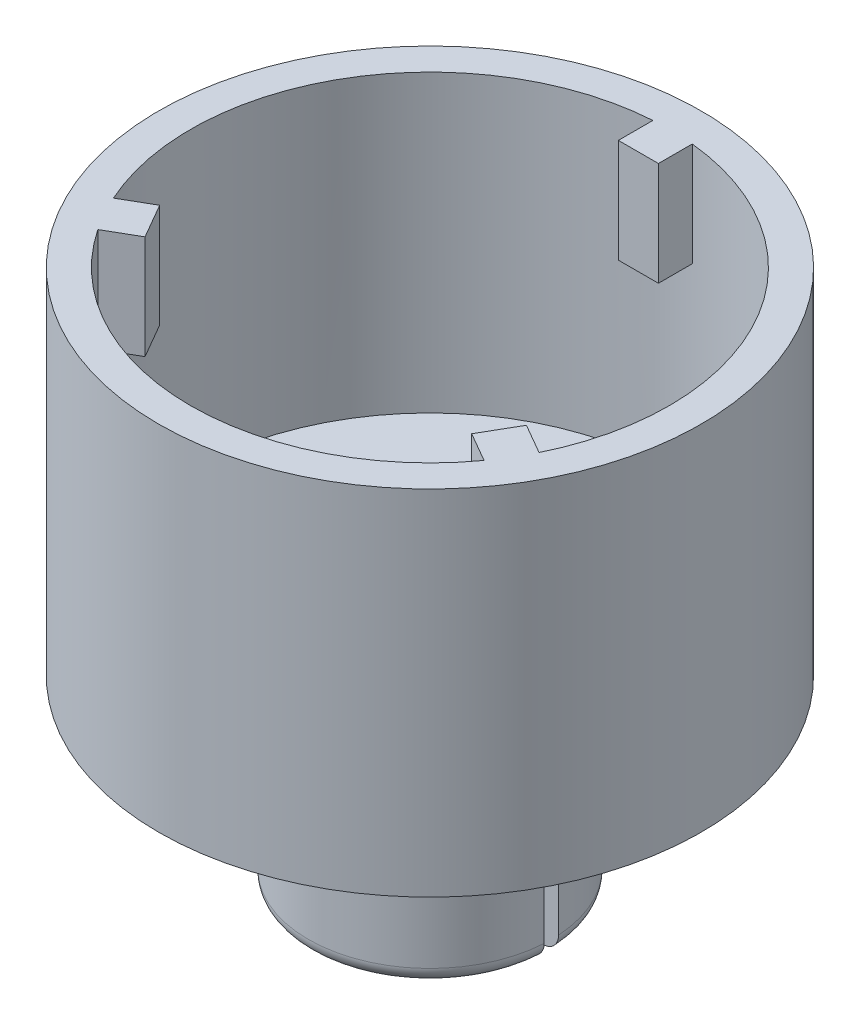
ISO-10303-21;
HEADER;
FILE_DESCRIPTION(('STEP AP214'),'2;1');
FILE_NAME('part.step','',(''),(''),'','','');
FILE_SCHEMA(('AUTOMOTIVE_DESIGN { 1 0 10303 214 1 1 1 1 }'));
ENDSEC;
DATA;
#1=APPLICATION_CONTEXT('core data for automotive mechanical design processes');
#2=APPLICATION_PROTOCOL_DEFINITION('international standard','automotive_design',2000,#1);
#3=PRODUCT_CONTEXT('',#1,'mechanical');
#4=PRODUCT('Part','Part','',(#3));
#5=PRODUCT_RELATED_PRODUCT_CATEGORY('part','',(#4));
#6=PRODUCT_DEFINITION_FORMATION('','',#4);
#7=PRODUCT_DEFINITION_CONTEXT('part definition',#1,'design');
#8=PRODUCT_DEFINITION('design','',#6,#7);
#9=PRODUCT_DEFINITION_SHAPE('','',#8);
#10=(LENGTH_UNIT() NAMED_UNIT(*) SI_UNIT(.MILLI.,.METRE.));
#11=(NAMED_UNIT(*) PLANE_ANGLE_UNIT() SI_UNIT($,.RADIAN.));
#12=(NAMED_UNIT(*) SI_UNIT($,.STERADIAN.) SOLID_ANGLE_UNIT());
#13=UNCERTAINTY_MEASURE_WITH_UNIT(LENGTH_MEASURE(1.E-05),#10,'distance_accuracy_value','');
#14=(GEOMETRIC_REPRESENTATION_CONTEXT(3) GLOBAL_UNCERTAINTY_ASSIGNED_CONTEXT((#13)) GLOBAL_UNIT_ASSIGNED_CONTEXT((#10,
#11,#12)) REPRESENTATION_CONTEXT('',''));
#15=CARTESIAN_POINT('',(0.,0.,0.));
#16=DIRECTION('',(0.,0.,1.));
#17=DIRECTION('',(1.,0.,0.));
#18=AXIS2_PLACEMENT_3D('',#15,#16,#17);
#19=CARTESIAN_POINT('',(0.,-23.,0.));
#20=DIRECTION('',(0.,1.,0.));
#21=DIRECTION('',(0.,0.,1.));
#22=AXIS2_PLACEMENT_3D('',#19,#20,#21);
#23=CYLINDRICAL_SURFACE('',#22,15.25);
#24=DIRECTION('',(0.,1.,0.));
#25=VECTOR('',#24,1.);
#26=CARTESIAN_POINT('',(-15.2232202518428,-23.,0.903363251346434));
#27=LINE('',#26,#25);
#28=CARTESIAN_POINT('',(-15.2232202518428,-7.,0.903363251346434));
#29=VERTEX_POINT('',#28);
#30=CARTESIAN_POINT('',(-15.2232202518428,-21.,0.903363251346434));
#31=VERTEX_POINT('',#30);
#32=EDGE_CURVE('E261',#29,#31,#27,.F.);
#33=ORIENTED_EDGE('',*,*,#32,.T.);
#34=CARTESIAN_POINT('',(0.,-21.,0.));
#35=DIRECTION('',(0.,-1.,0.));
#36=DIRECTION('',(0.,0.,-1.));
#37=AXIS2_PLACEMENT_3D('',#34,#35,#36);
#38=CIRCLE('',#37,15.25);
#39=CARTESIAN_POINT('',(15.2232202518428,-21.,0.903363251346434));
#40=VERTEX_POINT('',#39);
#41=EDGE_CURVE('E253',#31,#40,#38,.F.);
#42=ORIENTED_EDGE('',*,*,#41,.T.);
#43=DIRECTION('',(0.,1.,0.));
#44=VECTOR('',#43,1.);
#45=CARTESIAN_POINT('',(15.2232202518428,-23.,0.903363251346434));
#46=LINE('',#45,#44);
#47=CARTESIAN_POINT('',(15.2232202518428,-7.,0.903363251346434));
#48=VERTEX_POINT('',#47);
#49=EDGE_CURVE('E267',#40,#48,#46,.T.);
#50=ORIENTED_EDGE('',*,*,#49,.T.);
#51=CARTESIAN_POINT('',(0.,-7.,0.));
#52=DIRECTION('',(0.,-1.,0.));
#53=DIRECTION('',(0.,0.,-1.));
#54=AXIS2_PLACEMENT_3D('',#51,#52,#53);
#55=CIRCLE('',#54,15.25);
#56=EDGE_CURVE('E172',#48,#29,#55,.T.);
#57=ORIENTED_EDGE('',*,*,#56,.T.);
#58=EDGE_LOOP('',(#33,#42,#50,#57));
#59=FACE_BOUND('',#58,.T.);
#60=ADVANCED_FACE('F36',(#59),#23,.T.);
#61=CARTESIAN_POINT('',(0.,-23.,0.));
#62=DIRECTION('',(0.,-1.,0.));
#63=DIRECTION('',(0.,0.,-1.));
#64=AXIS2_PLACEMENT_3D('',#61,#62,#63);
#65=PLANE('',#64);
#66=DIRECTION('',(-1.,0.,0.));
#67=VECTOR('',#66,1.);
#68=CARTESIAN_POINT('',(0.,-23.,0.903363251346434));
#69=LINE('',#68,#67);
#70=CARTESIAN_POINT('',(13.2191692188321,-23.,0.903363251346434));
#71=VERTEX_POINT('',#70);
#72=CARTESIAN_POINT('',(-13.2191692188321,-23.,0.903363251346434));
#73=VERTEX_POINT('',#72);
#74=EDGE_CURVE('E204',#71,#73,#69,.T.);
#75=ORIENTED_EDGE('',*,*,#74,.F.);
#76=CARTESIAN_POINT('',(0.,-23.,0.));
#77=DIRECTION('',(0.,-1.,0.));
#78=DIRECTION('',(0.,0.,-1.));
#79=AXIS2_PLACEMENT_3D('',#76,#77,#78);
#80=CIRCLE('',#79,13.25);
#81=EDGE_CURVE('E207',#71,#73,#80,.T.);
#82=ORIENTED_EDGE('',*,*,#81,.T.);
#83=EDGE_LOOP('',(#75,#82));
#84=FACE_BOUND('',#83,.T.);
#85=ADVANCED_FACE('F271',(#84),#65,.T.);
#86=CARTESIAN_POINT('',(0.,44.3,0.));
#87=DIRECTION('',(0.,-1.,0.));
#88=DIRECTION('',(0.,0.,-1.));
#89=AXIS2_PLACEMENT_3D('',#86,#87,#88);
#90=CYLINDRICAL_SURFACE('',#89,34.);
#91=CARTESIAN_POINT('',(0.,44.3,0.));
#92=DIRECTION('',(0.,1.,0.));
#93=DIRECTION('',(0.,0.,1.));
#94=AXIS2_PLACEMENT_3D('',#91,#92,#93);
#95=CIRCLE('',#94,34.);
#96=CARTESIAN_POINT('',(0.,44.3,34.));
#97=VERTEX_POINT('',#96);
#98=EDGE_CURVE('E173',#97,#97,#95,.T.);
#99=ORIENTED_EDGE('',*,*,#98,.F.);
#100=EDGE_LOOP('',(#99));
#101=FACE_BOUND('',#100,.T.);
#102=CARTESIAN_POINT('',(0.,0.,0.));
#103=DIRECTION('',(0.,1.,0.));
#104=DIRECTION('',(0.,0.,1.));
#105=AXIS2_PLACEMENT_3D('',#102,#103,#104);
#106=CIRCLE('',#105,34.);
#107=CARTESIAN_POINT('',(0.,0.,34.));
#108=VERTEX_POINT('',#107);
#109=EDGE_CURVE('E178',#108,#108,#106,.T.);
#110=ORIENTED_EDGE('',*,*,#109,.T.);
#111=EDGE_LOOP('',(#110));
#112=FACE_BOUND('',#111,.T.);
#113=ADVANCED_FACE('F273',(#101,#112),#90,.T.);
#114=CARTESIAN_POINT('',(0.,44.3,0.));
#115=DIRECTION('',(0.,1.,0.));
#116=DIRECTION('',(0.,0.,1.));
#117=AXIS2_PLACEMENT_3D('',#114,#115,#116);
#118=PLANE('',#117);
#119=CARTESIAN_POINT('',(0.,44.3,0.));
#120=DIRECTION('',(0.,1.,0.));
#121=DIRECTION('',(0.,0.,1.));
#122=AXIS2_PLACEMENT_3D('',#119,#120,#121);
#123=CIRCLE('',#122,30.);
#124=CARTESIAN_POINT('',(-1.99053412286535,44.3,-29.933890056351));
#125=VERTEX_POINT('',#124);
#126=CARTESIAN_POINT('',(-27.3630036166739,44.3,12.2990256961229));
#127=VERTEX_POINT('',#126);
#128=EDGE_CURVE('E192',#125,#127,#123,.T.);
#129=ORIENTED_EDGE('',*,*,#128,.F.);
#130=DIRECTION('',(0.,0.,1.));
#131=VECTOR('',#130,1.);
#132=CARTESIAN_POINT('',(-1.99053412286535,44.3,-29.933890056351));
#133=LINE('',#132,#131);
#134=CARTESIAN_POINT('',(-1.99053412286506,44.3,-25.6053170757624));
#135=VERTEX_POINT('',#134);
#136=EDGE_CURVE('E589',#125,#135,#133,.T.);
#137=ORIENTED_EDGE('',*,*,#136,.T.);
#138=DIRECTION('',(1.,0.,0.));
#139=VECTOR('',#138,1.);
#140=CARTESIAN_POINT('',(-1.99053412286506,44.3,-25.6053170757624));
#141=LINE('',#140,#139);
#142=CARTESIAN_POINT('',(3.03023311369694,44.3,-25.6053170757624));
#143=VERTEX_POINT('',#142);
#144=EDGE_CURVE('E610',#135,#143,#141,.T.);
#145=ORIENTED_EDGE('',*,*,#144,.T.);
#146=DIRECTION('',(0.,0.,-1.));
#147=VECTOR('',#146,1.);
#148=CARTESIAN_POINT('',(3.03023311369694,44.3,-25.6053170757624));
#149=LINE('',#148,#147);
#150=CARTESIAN_POINT('',(3.03023311369666,44.3,-29.8465691039465));
#151=VERTEX_POINT('',#150);
#152=EDGE_CURVE('E599',#143,#151,#149,.T.);
#153=ORIENTED_EDGE('',*,*,#152,.T.);
#154=CARTESIAN_POINT('',(26.918776284323,44.3,13.2430919106745));
#155=VERTEX_POINT('',#154);
#156=EDGE_CURVE('E187',#155,#151,#123,.T.);
#157=ORIENTED_EDGE('',*,*,#156,.F.);
#158=DIRECTION('',(-0.866025403784455,0.,-0.499999999999972));
#159=VECTOR('',#158,1.);
#160=CARTESIAN_POINT('',(26.918776284323,44.3,13.2430919106745));
#161=LINE('',#160,#159);
#162=CARTESIAN_POINT('',(23.1701221209983,44.3,11.0788054203803));
#163=VERTEX_POINT('',#162);
#164=EDGE_CURVE('E559',#155,#163,#161,.T.);
#165=ORIENTED_EDGE('',*,*,#164,.T.);
#166=DIRECTION('',(-0.500000000000001,0.,0.866025403784438));
#167=VECTOR('',#166,1.);
#168=CARTESIAN_POINT('',(23.1701221209983,44.3,11.0788054203803));
#169=LINE('',#168,#167);
#170=CARTESIAN_POINT('',(20.6597385027173,44.3,15.4269173937316));
#171=VERTEX_POINT('',#170);
#172=EDGE_CURVE('E581',#163,#171,#169,.T.);
#173=ORIENTED_EDGE('',*,*,#172,.T.);
#174=DIRECTION('',(0.866025403784455,0.,0.499999999999971));
#175=VECTOR('',#174,1.);
#176=CARTESIAN_POINT('',(20.6597385027173,44.3,15.4269173937316));
#177=LINE('',#176,#175);
#178=CARTESIAN_POINT('',(24.332770502977,44.3,17.5475434078235));
#179=VERTEX_POINT('',#178);
#180=EDGE_CURVE('E569',#171,#179,#177,.T.);
#181=ORIENTED_EDGE('',*,*,#180,.T.);
#182=CARTESIAN_POINT('',(-24.9282421614578,44.3,16.6907981456764));
#183=VERTEX_POINT('',#182);
#184=EDGE_CURVE('E193',#183,#179,#123,.T.);
#185=ORIENTED_EDGE('',*,*,#184,.F.);
#186=DIRECTION('',(0.866025403784443,0.,-0.499999999999992));
#187=VECTOR('',#186,1.);
#188=CARTESIAN_POINT('',(-24.9282421614578,44.3,16.6907981456764));
#189=LINE('',#188,#187);
#190=CARTESIAN_POINT('',(-21.1795879981326,44.3,14.5265116553818));
#191=VERTEX_POINT('',#190);
#192=EDGE_CURVE('E535',#183,#191,#189,.T.);
#193=ORIENTED_EDGE('',*,*,#192,.T.);
#194=DIRECTION('',(-0.500000000000112,0.,-0.866025403784374));
#195=VECTOR('',#194,1.);
#196=CARTESIAN_POINT('',(-21.1795879981326,44.3,14.5265116553818));
#197=LINE('',#196,#195);
#198=CARTESIAN_POINT('',(-23.6899716164142,44.3,10.1783996820308));
#199=VERTEX_POINT('',#198);
#200=EDGE_CURVE('E551',#191,#199,#197,.T.);
#201=ORIENTED_EDGE('',*,*,#200,.T.);
#202=DIRECTION('',(-0.866025403784438,0.,0.5));
#203=VECTOR('',#202,1.);
#204=CARTESIAN_POINT('',(-23.6899716164142,44.3,10.1783996820308));
#205=LINE('',#204,#203);
#206=EDGE_CURVE('E539',#199,#127,#205,.T.);
#207=ORIENTED_EDGE('',*,*,#206,.T.);
#208=EDGE_LOOP('',(#129,#137,#145,#153,#157,#165,#173,#181,#185,#193,#201,#207));
#209=FACE_BOUND('',#208,.T.);
#210=ORIENTED_EDGE('',*,*,#98,.T.);
#211=EDGE_LOOP('',(#210));
#212=FACE_BOUND('',#211,.T.);
#213=ADVANCED_FACE('F280',(#209,#212),#118,.T.);
#214=CARTESIAN_POINT('',(0.,0.,0.));
#215=DIRECTION('',(0.,1.,0.));
#216=DIRECTION('',(0.,0.,1.));
#217=AXIS2_PLACEMENT_3D('',#214,#215,#216);
#218=PLANE('',#217);
#219=CARTESIAN_POINT('',(0.,0.,0.));
#220=DIRECTION('',(0.,1.,0.));
#221=DIRECTION('',(0.,0.,1.));
#222=AXIS2_PLACEMENT_3D('',#219,#220,#221);
#223=CIRCLE('',#222,24.5);
#224=CARTESIAN_POINT('',(0.,0.,24.5));
#225=VERTEX_POINT('',#224);
#226=EDGE_CURVE('E199',#225,#225,#223,.T.);
#227=ORIENTED_EDGE('',*,*,#226,.T.);
#228=EDGE_LOOP('',(#227));
#229=FACE_BOUND('',#228,.T.);
#230=ORIENTED_EDGE('',*,*,#109,.F.);
#231=EDGE_LOOP('',(#230));
#232=FACE_BOUND('',#231,.T.);
#233=ADVANCED_FACE('F413',(#229,#232),#218,.F.);
#234=CARTESIAN_POINT('',(0.,7.3,0.));
#235=DIRECTION('',(0.,1.,0.));
#236=DIRECTION('',(0.,0.,1.));
#237=AXIS2_PLACEMENT_3D('',#234,#235,#236);
#238=CYLINDRICAL_SURFACE('',#237,30.);
#239=ORIENTED_EDGE('',*,*,#128,.T.);
#240=DIRECTION('',(0.,1.,0.));
#241=VECTOR('',#240,1.);
#242=CARTESIAN_POINT('',(-27.3630036166739,31.3,12.2990256961229));
#243=LINE('',#242,#241);
#244=CARTESIAN_POINT('',(-27.3630036166739,31.3,12.2990256961229));
#245=VERTEX_POINT('',#244);
#246=EDGE_CURVE('E556',#245,#127,#243,.T.);
#247=ORIENTED_EDGE('',*,*,#246,.F.);
#248=CARTESIAN_POINT('',(0.,31.3,0.));
#249=DIRECTION('',(0.,1.,0.));
#250=DIRECTION('',(0.,0.,1.));
#251=AXIS2_PLACEMENT_3D('',#248,#249,#250);
#252=CIRCLE('',#251,30.);
#253=CARTESIAN_POINT('',(-24.9282421614578,31.3,16.6907981456764));
#254=VERTEX_POINT('',#253);
#255=EDGE_CURVE('E536',#245,#254,#252,.T.);
#256=ORIENTED_EDGE('',*,*,#255,.T.);
#257=DIRECTION('',(0.,1.,0.));
#258=VECTOR('',#257,1.);
#259=CARTESIAN_POINT('',(-24.9282421614578,31.3,16.6907981456764));
#260=LINE('',#259,#258);
#261=EDGE_CURVE('E548',#254,#183,#260,.T.);
#262=ORIENTED_EDGE('',*,*,#261,.T.);
#263=ORIENTED_EDGE('',*,*,#184,.T.);
#264=DIRECTION('',(0.,1.,0.));
#265=VECTOR('',#264,1.);
#266=CARTESIAN_POINT('',(24.332770502977,31.3,17.5475434078235));
#267=LINE('',#266,#265);
#268=CARTESIAN_POINT('',(24.332770502977,31.3,17.5475434078235));
#269=VERTEX_POINT('',#268);
#270=EDGE_CURVE('E586',#269,#179,#267,.T.);
#271=ORIENTED_EDGE('',*,*,#270,.F.);
#272=CARTESIAN_POINT('',(0.,31.3,0.));
#273=DIRECTION('',(0.,1.,0.));
#274=DIRECTION('',(0.,0.,1.));
#275=AXIS2_PLACEMENT_3D('',#272,#273,#274);
#276=CIRCLE('',#275,30.);
#277=CARTESIAN_POINT('',(26.918776284323,31.3,13.2430919106745));
#278=VERTEX_POINT('',#277);
#279=EDGE_CURVE('E566',#269,#278,#276,.T.);
#280=ORIENTED_EDGE('',*,*,#279,.T.);
#281=DIRECTION('',(0.,1.,0.));
#282=VECTOR('',#281,1.);
#283=CARTESIAN_POINT('',(26.918776284323,31.3,13.2430919106745));
#284=LINE('',#283,#282);
#285=EDGE_CURVE('E578',#278,#155,#284,.T.);
#286=ORIENTED_EDGE('',*,*,#285,.T.);
#287=ORIENTED_EDGE('',*,*,#156,.T.);
#288=DIRECTION('',(0.,1.,0.));
#289=VECTOR('',#288,1.);
#290=CARTESIAN_POINT('',(3.03023311369666,31.3,-29.8465691039465));
#291=LINE('',#290,#289);
#292=CARTESIAN_POINT('',(3.03023311369666,31.3,-29.8465691039465));
#293=VERTEX_POINT('',#292);
#294=EDGE_CURVE('E188',#293,#151,#291,.T.);
#295=ORIENTED_EDGE('',*,*,#294,.F.);
#296=CARTESIAN_POINT('',(0.,31.3,0.));
#297=DIRECTION('',(0.,1.,0.));
#298=DIRECTION('',(0.,0.,1.));
#299=AXIS2_PLACEMENT_3D('',#296,#297,#298);
#300=CIRCLE('',#299,30.);
#301=CARTESIAN_POINT('',(-1.99053412286535,31.3,-29.933890056351));
#302=VERTEX_POINT('',#301);
#303=EDGE_CURVE('E596',#293,#302,#300,.T.);
#304=ORIENTED_EDGE('',*,*,#303,.T.);
#305=DIRECTION('',(0.,1.,0.));
#306=VECTOR('',#305,1.);
#307=CARTESIAN_POINT('',(-1.99053412286535,31.3,-29.933890056351));
#308=LINE('',#307,#306);
#309=EDGE_CURVE('E182',#302,#125,#308,.T.);
#310=ORIENTED_EDGE('',*,*,#309,.T.);
#311=EDGE_LOOP('',(#239,#247,#256,#262,#263,#271,#280,#286,#287,#295,#304,#310));
#312=FACE_BOUND('',#311,.T.);
#313=CARTESIAN_POINT('',(0.,7.3,0.));
#314=DIRECTION('',(0.,1.,0.));
#315=DIRECTION('',(0.,0.,1.));
#316=AXIS2_PLACEMENT_3D('',#313,#314,#315);
#317=CIRCLE('',#316,30.);
#318=CARTESIAN_POINT('',(0.,7.3,30.));
#319=VERTEX_POINT('',#318);
#320=EDGE_CURVE('E189',#319,#319,#317,.T.);
#321=ORIENTED_EDGE('',*,*,#320,.F.);
#322=EDGE_LOOP('',(#321));
#323=FACE_BOUND('',#322,.T.);
#324=ADVANCED_FACE('F427',(#312,#323),#238,.F.);
#325=CARTESIAN_POINT('',(0.,7.3,0.));
#326=DIRECTION('',(0.,1.,0.));
#327=DIRECTION('',(0.,0.,1.));
#328=AXIS2_PLACEMENT_3D('',#325,#326,#327);
#329=PLANE('',#328);
#330=ORIENTED_EDGE('',*,*,#320,.T.);
#331=EDGE_LOOP('',(#330));
#332=FACE_BOUND('',#331,.T.);
#333=ADVANCED_FACE('F431',(#332),#329,.T.);
#334=CARTESIAN_POINT('',(0.,-7.,0.));
#335=DIRECTION('',(0.,1.,0.));
#336=DIRECTION('',(0.,0.,1.));
#337=AXIS2_PLACEMENT_3D('',#334,#335,#336);
#338=CYLINDRICAL_SURFACE('',#337,19.5);
#339=CARTESIAN_POINT('',(0.,-5.,0.));
#340=DIRECTION('',(0.,1.,0.));
#341=DIRECTION('',(0.,0.,1.));
#342=AXIS2_PLACEMENT_3D('',#339,#340,#341);
#343=CIRCLE('',#342,19.5);
#344=CARTESIAN_POINT('',(0.,-5.,19.5));
#345=VERTEX_POINT('',#344);
#346=EDGE_CURVE('E176',#345,#345,#343,.F.);
#347=ORIENTED_EDGE('',*,*,#346,.T.);
#348=EDGE_LOOP('',(#347));
#349=FACE_BOUND('',#348,.T.);
#350=CARTESIAN_POINT('',(0.,-7.,0.));
#351=DIRECTION('',(0.,-1.,0.));
#352=DIRECTION('',(0.,0.,-1.));
#353=AXIS2_PLACEMENT_3D('',#350,#351,#352);
#354=CIRCLE('',#353,19.5);
#355=CARTESIAN_POINT('',(0.,-7.,-19.5));
#356=VERTEX_POINT('',#355);
#357=EDGE_CURVE('E184',#356,#356,#354,.T.);
#358=ORIENTED_EDGE('',*,*,#357,.F.);
#359=EDGE_LOOP('',(#358));
#360=FACE_BOUND('',#359,.T.);
#361=ADVANCED_FACE('F442',(#349,#360),#338,.T.);
#362=CARTESIAN_POINT('',(0.,-7.,0.));
#363=DIRECTION('',(0.,-1.,0.));
#364=DIRECTION('',(0.,0.,-1.));
#365=AXIS2_PLACEMENT_3D('',#362,#363,#364);
#366=PLANE('',#365);
#367=ORIENTED_EDGE('',*,*,#56,.F.);
#368=DIRECTION('',(1.,0.,0.));
#369=VECTOR('',#368,1.);
#370=CARTESIAN_POINT('',(33.0968426441505,-7.,0.903363251346434));
#371=LINE('',#370,#369);
#372=EDGE_CURVE('E169',#29,#48,#371,.T.);
#373=ORIENTED_EDGE('',*,*,#372,.F.);
#374=EDGE_LOOP('',(#367,#373));
#375=FACE_BOUND('',#374,.T.);
#376=CARTESIAN_POINT('',(-15.2232202518428,-7.,-0.903363251346434));
#377=VERTEX_POINT('',#376);
#378=CARTESIAN_POINT('',(15.2232202518428,-7.,-0.903363251346434));
#379=VERTEX_POINT('',#378);
#380=EDGE_CURVE('E168',#377,#379,#55,.T.);
#381=ORIENTED_EDGE('',*,*,#380,.F.);
#382=DIRECTION('',(-1.,0.,0.));
#383=VECTOR('',#382,1.);
#384=CARTESIAN_POINT('',(33.0968426441505,-7.,-0.903363251346434));
#385=LINE('',#384,#383);
#386=EDGE_CURVE('E160',#379,#377,#385,.T.);
#387=ORIENTED_EDGE('',*,*,#386,.F.);
#388=EDGE_LOOP('',(#381,#387));
#389=FACE_BOUND('',#388,.T.);
#390=ORIENTED_EDGE('',*,*,#357,.T.);
#391=EDGE_LOOP('',(#390));
#392=FACE_BOUND('',#391,.T.);
#393=ADVANCED_FACE('F166',(#375,#389,#392),#366,.T.);
#394=DIRECTION('',(0.,1.,0.));
#395=VECTOR('',#394,1.);
#396=CARTESIAN_POINT('',(15.2232202518428,-23.,-0.903363251346434));
#397=LINE('',#396,#395);
#398=CARTESIAN_POINT('',(15.2232202518428,-21.,-0.903363251346434));
#399=VERTEX_POINT('',#398);
#400=EDGE_CURVE('E157',#379,#399,#397,.F.);
#401=ORIENTED_EDGE('',*,*,#400,.T.);
#402=CARTESIAN_POINT('',(0.,-21.,0.));
#403=DIRECTION('',(0.,-1.,0.));
#404=DIRECTION('',(0.,0.,-1.));
#405=AXIS2_PLACEMENT_3D('',#402,#403,#404);
#406=CIRCLE('',#405,15.25);
#407=CARTESIAN_POINT('',(-15.2232202518428,-21.,-0.903363251346434));
#408=VERTEX_POINT('',#407);
#409=EDGE_CURVE('E11',#399,#408,#406,.F.);
#410=ORIENTED_EDGE('',*,*,#409,.T.);
#411=DIRECTION('',(0.,1.,0.));
#412=VECTOR('',#411,1.);
#413=CARTESIAN_POINT('',(-15.2232202518428,-23.,-0.903363251346434));
#414=LINE('',#413,#412);
#415=EDGE_CURVE('E163',#408,#377,#414,.T.);
#416=ORIENTED_EDGE('',*,*,#415,.T.);
#417=ORIENTED_EDGE('',*,*,#380,.T.);
#418=EDGE_LOOP('',(#401,#410,#416,#417));
#419=FACE_BOUND('',#418,.T.);
#420=ADVANCED_FACE('F171',(#419),#23,.T.);
#421=DIRECTION('',(1.,0.,0.));
#422=VECTOR('',#421,1.);
#423=CARTESIAN_POINT('',(0.,-23.,-0.903363251346434));
#424=LINE('',#423,#422);
#425=CARTESIAN_POINT('',(-13.2191692188321,-23.,-0.903363251346434));
#426=VERTEX_POINT('',#425);
#427=CARTESIAN_POINT('',(13.2191692188321,-23.,-0.903363251346434));
#428=VERTEX_POINT('',#427);
#429=EDGE_CURVE('E202',#426,#428,#424,.T.);
#430=ORIENTED_EDGE('',*,*,#429,.F.);
#431=CARTESIAN_POINT('',(0.,-23.,0.));
#432=DIRECTION('',(0.,-1.,0.));
#433=DIRECTION('',(0.,0.,-1.));
#434=AXIS2_PLACEMENT_3D('',#431,#432,#433);
#435=CIRCLE('',#434,13.25);
#436=EDGE_CURVE('E249',#426,#428,#435,.T.);
#437=ORIENTED_EDGE('',*,*,#436,.T.);
#438=EDGE_LOOP('',(#430,#437));
#439=FACE_BOUND('',#438,.T.);
#440=ADVANCED_FACE('F275',(#439),#65,.T.);
#441=CARTESIAN_POINT('',(0.,-5.,0.));
#442=DIRECTION('',(0.,1.,0.));
#443=DIRECTION('',(0.,0.,1.));
#444=AXIS2_PLACEMENT_3D('',#441,#442,#443);
#445=TOROIDAL_SURFACE('',#444,24.5,5.);
#446=ORIENTED_EDGE('',*,*,#226,.F.);
#447=EDGE_LOOP('',(#446));
#448=FACE_BOUND('',#447,.T.);
#449=ORIENTED_EDGE('',*,*,#346,.F.);
#450=EDGE_LOOP('',(#449));
#451=FACE_BOUND('',#450,.T.);
#452=ADVANCED_FACE('F286',(#448,#451),#445,.F.);
#453=CARTESIAN_POINT('',(3.03023311369694,31.3,-25.6053170757624));
#454=DIRECTION('',(1.,0.,0.));
#455=DIRECTION('',(0.,0.,-1.));
#456=AXIS2_PLACEMENT_3D('',#453,#454,#455);
#457=PLANE('',#456);
#458=ORIENTED_EDGE('',*,*,#152,.F.);
#459=DIRECTION('',(0.,1.,0.));
#460=VECTOR('',#459,1.);
#461=CARTESIAN_POINT('',(3.03023311369694,31.3,-25.6053170757624));
#462=LINE('',#461,#460);
#463=CARTESIAN_POINT('',(3.03023311369694,31.3,-25.6053170757624));
#464=VERTEX_POINT('',#463);
#465=EDGE_CURVE('E617',#464,#143,#462,.T.);
#466=ORIENTED_EDGE('',*,*,#465,.F.);
#467=DIRECTION('',(0.,0.,-1.));
#468=VECTOR('',#467,1.);
#469=CARTESIAN_POINT('',(3.03023311369694,31.3,-25.6053170757624));
#470=LINE('',#469,#468);
#471=EDGE_CURVE('E605',#464,#293,#470,.T.);
#472=ORIENTED_EDGE('',*,*,#471,.T.);
#473=ORIENTED_EDGE('',*,*,#294,.T.);
#474=EDGE_LOOP('',(#458,#466,#472,#473));
#475=FACE_BOUND('',#474,.T.);
#476=ADVANCED_FACE('F291',(#475),#457,.T.);
#477=CARTESIAN_POINT('',(-1.99053412286506,31.3,-25.6053170757624));
#478=DIRECTION('',(0.,0.,1.));
#479=DIRECTION('',(1.,0.,0.));
#480=AXIS2_PLACEMENT_3D('',#477,#478,#479);
#481=PLANE('',#480);
#482=ORIENTED_EDGE('',*,*,#144,.F.);
#483=DIRECTION('',(0.,1.,0.));
#484=VECTOR('',#483,1.);
#485=CARTESIAN_POINT('',(-1.99053412286506,31.3,-25.6053170757624));
#486=LINE('',#485,#484);
#487=CARTESIAN_POINT('',(-1.99053412286506,31.3,-25.6053170757624));
#488=VERTEX_POINT('',#487);
#489=EDGE_CURVE('E618',#488,#135,#486,.T.);
#490=ORIENTED_EDGE('',*,*,#489,.F.);
#491=DIRECTION('',(1.,0.,0.));
#492=VECTOR('',#491,1.);
#493=CARTESIAN_POINT('',(-1.99053412286506,31.3,-25.6053170757624));
#494=LINE('',#493,#492);
#495=EDGE_CURVE('E602',#488,#464,#494,.T.);
#496=ORIENTED_EDGE('',*,*,#495,.T.);
#497=ORIENTED_EDGE('',*,*,#465,.T.);
#498=EDGE_LOOP('',(#482,#490,#496,#497));
#499=FACE_BOUND('',#498,.T.);
#500=ADVANCED_FACE('F385',(#499),#481,.T.);
#501=CARTESIAN_POINT('',(-1.99053412286535,31.3,-29.933890056351));
#502=DIRECTION('',(-1.,0.,0.));
#503=DIRECTION('',(0.,0.,1.));
#504=AXIS2_PLACEMENT_3D('',#501,#502,#503);
#505=PLANE('',#504);
#506=ORIENTED_EDGE('',*,*,#136,.F.);
#507=ORIENTED_EDGE('',*,*,#309,.F.);
#508=DIRECTION('',(0.,0.,1.));
#509=VECTOR('',#508,1.);
#510=CARTESIAN_POINT('',(-1.99053412286535,31.3,-29.933890056351));
#511=LINE('',#510,#509);
#512=EDGE_CURVE('E598',#302,#488,#511,.T.);
#513=ORIENTED_EDGE('',*,*,#512,.T.);
#514=ORIENTED_EDGE('',*,*,#489,.T.);
#515=EDGE_LOOP('',(#506,#507,#513,#514));
#516=FACE_BOUND('',#515,.T.);
#517=ADVANCED_FACE('F377',(#516),#505,.T.);
#518=CARTESIAN_POINT('',(0.,31.3,0.));
#519=DIRECTION('',(0.,1.,0.));
#520=DIRECTION('',(0.,0.,1.));
#521=AXIS2_PLACEMENT_3D('',#518,#519,#520);
#522=PLANE('',#521);
#523=ORIENTED_EDGE('',*,*,#303,.F.);
#524=ORIENTED_EDGE('',*,*,#471,.F.);
#525=ORIENTED_EDGE('',*,*,#495,.F.);
#526=ORIENTED_EDGE('',*,*,#512,.F.);
#527=EDGE_LOOP('',(#523,#524,#525,#526));
#528=FACE_BOUND('',#527,.T.);
#529=ADVANCED_FACE('F369',(#528),#522,.F.);
#530=CARTESIAN_POINT('',(20.6597385027173,31.3,15.4269173937316));
#531=DIRECTION('',(-0.499999999999971,0.,0.866025403784455));
#532=DIRECTION('',(0.866025403784455,0.,0.499999999999971));
#533=AXIS2_PLACEMENT_3D('',#530,#531,#532);
#534=PLANE('',#533);
#535=ORIENTED_EDGE('',*,*,#180,.F.);
#536=DIRECTION('',(0.,1.,0.));
#537=VECTOR('',#536,1.);
#538=CARTESIAN_POINT('',(20.6597385027173,31.3,15.4269173937316));
#539=LINE('',#538,#537);
#540=CARTESIAN_POINT('',(20.6597385027173,31.3,15.4269173937316));
#541=VERTEX_POINT('',#540);
#542=EDGE_CURVE('E590',#541,#171,#539,.T.);
#543=ORIENTED_EDGE('',*,*,#542,.F.);
#544=DIRECTION('',(0.866025403784455,0.,0.499999999999971));
#545=VECTOR('',#544,1.);
#546=CARTESIAN_POINT('',(20.6597385027173,31.3,15.4269173937316));
#547=LINE('',#546,#545);
#548=EDGE_CURVE('E575',#541,#269,#547,.T.);
#549=ORIENTED_EDGE('',*,*,#548,.T.);
#550=ORIENTED_EDGE('',*,*,#270,.T.);
#551=EDGE_LOOP('',(#535,#543,#549,#550));
#552=FACE_BOUND('',#551,.T.);
#553=ADVANCED_FACE('F361',(#552),#534,.T.);
#554=CARTESIAN_POINT('',(23.1701221209983,31.3,11.0788054203803));
#555=DIRECTION('',(-0.866025403784438,0.,-0.500000000000001));
#556=DIRECTION('',(-0.500000000000001,0.,0.866025403784438));
#557=AXIS2_PLACEMENT_3D('',#554,#555,#556);
#558=PLANE('',#557);
#559=ORIENTED_EDGE('',*,*,#172,.F.);
#560=DIRECTION('',(0.,1.,0.));
#561=VECTOR('',#560,1.);
#562=CARTESIAN_POINT('',(23.1701221209983,31.3,11.0788054203803));
#563=LINE('',#562,#561);
#564=CARTESIAN_POINT('',(23.1701221209983,31.3,11.0788054203803));
#565=VERTEX_POINT('',#564);
#566=EDGE_CURVE('E592',#565,#163,#563,.T.);
#567=ORIENTED_EDGE('',*,*,#566,.F.);
#568=DIRECTION('',(-0.500000000000001,0.,0.866025403784438));
#569=VECTOR('',#568,1.);
#570=CARTESIAN_POINT('',(23.1701221209983,31.3,11.0788054203803));
#571=LINE('',#570,#569);
#572=EDGE_CURVE('E572',#565,#541,#571,.T.);
#573=ORIENTED_EDGE('',*,*,#572,.T.);
#574=ORIENTED_EDGE('',*,*,#542,.T.);
#575=EDGE_LOOP('',(#559,#567,#573,#574));
#576=FACE_BOUND('',#575,.T.);
#577=ADVANCED_FACE('F353',(#576),#558,.T.);
#578=CARTESIAN_POINT('',(26.918776284323,31.3,13.2430919106745));
#579=DIRECTION('',(0.499999999999972,0.,-0.866025403784455));
#580=DIRECTION('',(-0.866025403784455,0.,-0.499999999999972));
#581=AXIS2_PLACEMENT_3D('',#578,#579,#580);
#582=PLANE('',#581);
#583=ORIENTED_EDGE('',*,*,#164,.F.);
#584=ORIENTED_EDGE('',*,*,#285,.F.);
#585=DIRECTION('',(-0.866025403784455,0.,-0.499999999999972));
#586=VECTOR('',#585,1.);
#587=CARTESIAN_POINT('',(26.918776284323,31.3,13.2430919106745));
#588=LINE('',#587,#586);
#589=EDGE_CURVE('E568',#278,#565,#588,.T.);
#590=ORIENTED_EDGE('',*,*,#589,.T.);
#591=ORIENTED_EDGE('',*,*,#566,.T.);
#592=EDGE_LOOP('',(#583,#584,#590,#591));
#593=FACE_BOUND('',#592,.T.);
#594=ADVANCED_FACE('F345',(#593),#582,.T.);
#595=CARTESIAN_POINT('',(0.,31.3,0.));
#596=DIRECTION('',(0.,1.,0.));
#597=DIRECTION('',(0.,0.,1.));
#598=AXIS2_PLACEMENT_3D('',#595,#596,#597);
#599=PLANE('',#598);
#600=ORIENTED_EDGE('',*,*,#279,.F.);
#601=ORIENTED_EDGE('',*,*,#548,.F.);
#602=ORIENTED_EDGE('',*,*,#572,.F.);
#603=ORIENTED_EDGE('',*,*,#589,.F.);
#604=EDGE_LOOP('',(#600,#601,#602,#603));
#605=FACE_BOUND('',#604,.T.);
#606=ADVANCED_FACE('F338',(#605),#599,.F.);
#607=CARTESIAN_POINT('',(-23.6899716164142,31.3,10.1783996820308));
#608=DIRECTION('',(-0.5,0.,-0.866025403784439));
#609=DIRECTION('',(-0.866025403784439,0.,0.5));
#610=AXIS2_PLACEMENT_3D('',#607,#608,#609);
#611=PLANE('',#610);
#612=ORIENTED_EDGE('',*,*,#206,.F.);
#613=DIRECTION('',(0.,1.,0.));
#614=VECTOR('',#613,1.);
#615=CARTESIAN_POINT('',(-23.6899716164142,31.3,10.1783996820308));
#616=LINE('',#615,#614);
#617=CARTESIAN_POINT('',(-23.6899716164142,31.3,10.1783996820308));
#618=VERTEX_POINT('',#617);
#619=EDGE_CURVE('E560',#618,#199,#616,.T.);
#620=ORIENTED_EDGE('',*,*,#619,.F.);
#621=DIRECTION('',(-0.866025403784438,0.,0.5));
#622=VECTOR('',#621,1.);
#623=CARTESIAN_POINT('',(-23.6899716164142,31.3,10.1783996820308));
#624=LINE('',#623,#622);
#625=EDGE_CURVE('E545',#618,#245,#624,.T.);
#626=ORIENTED_EDGE('',*,*,#625,.T.);
#627=ORIENTED_EDGE('',*,*,#246,.T.);
#628=EDGE_LOOP('',(#612,#620,#626,#627));
#629=FACE_BOUND('',#628,.T.);
#630=ADVANCED_FACE('F330',(#629),#611,.T.);
#631=CARTESIAN_POINT('',(-21.1795879981326,31.3,14.5265116553818));
#632=DIRECTION('',(0.866025403784374,0.,-0.500000000000112));
#633=DIRECTION('',(-0.500000000000112,0.,-0.866025403784374));
#634=AXIS2_PLACEMENT_3D('',#631,#632,#633);
#635=PLANE('',#634);
#636=ORIENTED_EDGE('',*,*,#200,.F.);
#637=DIRECTION('',(0.,1.,0.));
#638=VECTOR('',#637,1.);
#639=CARTESIAN_POINT('',(-21.1795879981326,31.3,14.5265116553818));
#640=LINE('',#639,#638);
#641=CARTESIAN_POINT('',(-21.1795879981326,31.3,14.5265116553818));
#642=VERTEX_POINT('',#641);
#643=EDGE_CURVE('E562',#642,#191,#640,.T.);
#644=ORIENTED_EDGE('',*,*,#643,.F.);
#645=DIRECTION('',(-0.500000000000112,0.,-0.866025403784374));
#646=VECTOR('',#645,1.);
#647=CARTESIAN_POINT('',(-21.1795879981326,31.3,14.5265116553818));
#648=LINE('',#647,#646);
#649=EDGE_CURVE('E542',#642,#618,#648,.T.);
#650=ORIENTED_EDGE('',*,*,#649,.T.);
#651=ORIENTED_EDGE('',*,*,#619,.T.);
#652=EDGE_LOOP('',(#636,#644,#650,#651));
#653=FACE_BOUND('',#652,.T.);
#654=ADVANCED_FACE('F322',(#653),#635,.T.);
#655=CARTESIAN_POINT('',(-24.9282421614578,31.3,16.6907981456764));
#656=DIRECTION('',(0.499999999999992,0.,0.866025403784443));
#657=DIRECTION('',(0.866025403784443,0.,-0.499999999999992));
#658=AXIS2_PLACEMENT_3D('',#655,#656,#657);
#659=PLANE('',#658);
#660=ORIENTED_EDGE('',*,*,#192,.F.);
#661=ORIENTED_EDGE('',*,*,#261,.F.);
#662=DIRECTION('',(0.866025403784443,0.,-0.499999999999992));
#663=VECTOR('',#662,1.);
#664=CARTESIAN_POINT('',(-24.9282421614578,31.3,16.6907981456764));
#665=LINE('',#664,#663);
#666=EDGE_CURVE('E538',#254,#642,#665,.T.);
#667=ORIENTED_EDGE('',*,*,#666,.T.);
#668=ORIENTED_EDGE('',*,*,#643,.T.);
#669=EDGE_LOOP('',(#660,#661,#667,#668));
#670=FACE_BOUND('',#669,.T.);
#671=ADVANCED_FACE('F314',(#670),#659,.T.);
#672=CARTESIAN_POINT('',(0.,31.3,0.));
#673=DIRECTION('',(0.,1.,0.));
#674=DIRECTION('',(0.,0.,1.));
#675=AXIS2_PLACEMENT_3D('',#672,#673,#674);
#676=PLANE('',#675);
#677=ORIENTED_EDGE('',*,*,#255,.F.);
#678=ORIENTED_EDGE('',*,*,#625,.F.);
#679=ORIENTED_EDGE('',*,*,#649,.F.);
#680=ORIENTED_EDGE('',*,*,#666,.F.);
#681=EDGE_LOOP('',(#677,#678,#679,#680));
#682=FACE_BOUND('',#681,.T.);
#683=ADVANCED_FACE('F230',(#682),#676,.F.);
#684=CARTESIAN_POINT('',(33.0968426441505,59.2183375863677,0.903363251346434));
#685=DIRECTION('',(0.,0.,1.));
#686=DIRECTION('',(1.,0.,0.));
#687=AXIS2_PLACEMENT_3D('',#684,#685,#686);
#688=PLANE('',#687);
#689=ORIENTED_EDGE('',*,*,#74,.T.);
#690=CARTESIAN_POINT('',(-13.2191692188321,-23.,0.903363251346434));
#691=CARTESIAN_POINT('',(-13.2756424415771,-22.9999995609033,0.903363251346434));
#692=CARTESIAN_POINT('',(-13.3320887054836,-22.9976177069956,0.903363251346434));
#693=CARTESIAN_POINT('',(-13.444578403289,-22.9881142320961,0.903363251346434));
#694=CARTESIAN_POINT('',(-13.5006218535148,-22.9809928043156,0.903363251346434));
#695=CARTESIAN_POINT('',(-13.6674559687125,-22.9525833628222,0.903363251346434));
#696=CARTESIAN_POINT('',(-13.777130720685,-22.924250021228,0.903363251346434));
#697=CARTESIAN_POINT('',(-13.990165743797,-22.8495662000696,0.903363251346434));
#698=CARTESIAN_POINT('',(-14.0935227313194,-22.8032064419995,0.903363251346434));
#699=CARTESIAN_POINT('',(-14.2909681297702,-22.6937771474923,0.903363251346434));
#700=CARTESIAN_POINT('',(-14.3850583874932,-22.6307109498138,0.903363251346434));
#701=CARTESIAN_POINT('',(-14.5611727518909,-22.4897357020745,0.903363251346434));
#702=CARTESIAN_POINT('',(-14.6432117380692,-22.4118452329068,0.903363251346434));
#703=CARTESIAN_POINT('',(-14.7930355008666,-22.2433537734592,0.903363251346434));
#704=CARTESIAN_POINT('',(-14.8608175189015,-22.1527503289859,0.903363251346434));
#705=CARTESIAN_POINT('',(-14.9800524877207,-21.9616010447955,0.903363251346434));
#706=CARTESIAN_POINT('',(-15.0315336292775,-21.8610727685841,0.903363251346434));
#707=CARTESIAN_POINT('',(-15.1168307364638,-21.6528115741693,0.903363251346434));
#708=CARTESIAN_POINT('',(-15.1506575112983,-21.5450831101023,0.903363251346434));
#709=CARTESIAN_POINT('',(-15.1911452567023,-21.3638957315863,0.903363251346434));
#710=CARTESIAN_POINT('',(-15.203166194833,-21.2915894160377,0.903363251346434));
#711=CARTESIAN_POINT('',(-15.2192024915324,-21.1461989766328,0.903363251346434));
#712=CARTESIAN_POINT('',(-15.2232292335094,-21.073116107964,0.903363251346434));
#713=CARTESIAN_POINT('',(-15.2232202518428,-21.,0.903363251346434));
#714=B_SPLINE_CURVE_WITH_KNOTS('',3,(#690,#691,#692,#693,#694,#695,#696,#697,#698,#699,#700,
#701,#702,#703,#704,#705,#706,#707,#708,#709,#710,#711,#712,#713),.UNSPECIFIED.,.F.,.F.,(4,2,2,
2,2,2,2,2,2,2,2,4),(0.,0.169315847013464,0.33862479220124,0.67670859120119,1.01496663858033,
1.35315713649493,1.69092650183992,2.02876116226415,2.3660083385944,2.70304878629595,
2.92253432632545,3.14170710311557),.UNSPECIFIED.);
#715=EDGE_CURVE('E217',#73,#31,#714,.T.);
#716=ORIENTED_EDGE('',*,*,#715,.T.);
#717=ORIENTED_EDGE('',*,*,#32,.F.);
#718=ORIENTED_EDGE('',*,*,#372,.T.);
#719=ORIENTED_EDGE('',*,*,#49,.F.);
#720=CARTESIAN_POINT('',(15.2232202518428,-21.,0.903363251346434));
#721=CARTESIAN_POINT('',(15.2232199232489,-21.0561948021802,0.903363251346434));
#722=CARTESIAN_POINT('',(15.2208462010748,-21.1123626608613,0.903363251346434));
#723=CARTESIAN_POINT('',(15.211376767415,-21.2242959584954,0.903363251346434));
#724=CARTESIAN_POINT('',(15.2042812970132,-21.2800614178472,0.903363251346434));
#725=CARTESIAN_POINT('',(15.1759810982783,-21.4460523458939,0.903363251346434));
#726=CARTESIAN_POINT('',(15.1477623870815,-21.5551651452531,0.903363251346434));
#727=CARTESIAN_POINT('',(15.0734106566527,-21.7671001409726,0.903363251346434));
#728=CARTESIAN_POINT('',(15.0272693095068,-21.8699193872293,0.903363251346434));
#729=CARTESIAN_POINT('',(14.9183959883233,-22.0663574694,0.903363251346434));
#730=CARTESIAN_POINT('',(14.8556667286063,-22.1599778071192,0.903363251346434));
#731=CARTESIAN_POINT('',(14.7153560416617,-22.3354365581613,0.903363251346434));
#732=CARTESIAN_POINT('',(14.6377642041245,-22.4172666423318,0.903363251346434));
#733=CARTESIAN_POINT('',(14.469946451435,-22.5667823902729,0.903363251346434));
#734=CARTESIAN_POINT('',(14.3797180536156,-22.6344652680558,0.903363251346434));
#735=CARTESIAN_POINT('',(14.1890336936746,-22.7538779272838,0.903363251346434));
#736=CARTESIAN_POINT('',(14.0885588357039,-22.8055774991095,0.903363251346434));
#737=CARTESIAN_POINT('',(13.8803857068313,-22.8913863101094,0.903363251346434));
#738=CARTESIAN_POINT('',(13.7726914572009,-22.925505251361,0.903363251346434));
#739=CARTESIAN_POINT('',(13.5901629405491,-22.9668623444403,0.903363251346434));
#740=CARTESIAN_POINT('',(13.5164605185664,-22.9792819990314,0.903363251346434));
#741=CARTESIAN_POINT('',(13.368238510768,-22.9958498253569,0.903363251346434));
#742=CARTESIAN_POINT('',(13.2937202413688,-23.0000097771421,0.903363251346434));
#743=CARTESIAN_POINT('',(13.2191692188321,-23.,0.903363251346434));
#744=B_SPLINE_CURVE_WITH_KNOTS('',3,(#720,#721,#722,#723,#724,#725,#726,#727,#728,#729,#730,
#731,#732,#733,#734,#735,#736,#737,#738,#739,#740,#741,#742,#743),.UNSPECIFIED.,.F.,.F.,(4,2,2,
2,2,2,2,2,2,2,2,4),(0.,0.168480781633668,0.336952961602159,0.673326346007657,1.00985621666657,
1.34633105416501,1.68304243888204,2.01982006931767,2.35723039660949,2.69445432008634,
2.91824695183647,3.14172017891371),.UNSPECIFIED.);
#745=EDGE_CURVE('E210',#40,#71,#744,.T.);
#746=ORIENTED_EDGE('',*,*,#745,.T.);
#747=EDGE_LOOP('',(#689,#716,#717,#718,#719,#746));
#748=FACE_BOUND('',#747,.T.);
#749=ADVANCED_FACE('F226',(#748),#688,.F.);
#750=CARTESIAN_POINT('',(33.0968426441505,59.2183375863677,-0.903363251346434));
#751=DIRECTION('',(0.,0.,-1.));
#752=DIRECTION('',(-1.,0.,0.));
#753=AXIS2_PLACEMENT_3D('',#750,#751,#752);
#754=PLANE('',#753);
#755=ORIENTED_EDGE('',*,*,#429,.T.);
#756=CARTESIAN_POINT('',(13.2191692188321,-23.,-0.903363251346434));
#757=CARTESIAN_POINT('',(13.2756424415771,-22.9999995609033,-0.903363251346434));
#758=CARTESIAN_POINT('',(13.3320887054836,-22.9976177069956,-0.903363251346434));
#759=CARTESIAN_POINT('',(13.444578403289,-22.9881142320961,-0.903363251346434));
#760=CARTESIAN_POINT('',(13.5006218535148,-22.9809928043156,-0.903363251346434));
#761=CARTESIAN_POINT('',(13.6674559687125,-22.9525833628222,-0.903363251346434));
#762=CARTESIAN_POINT('',(13.777130720685,-22.924250021228,-0.903363251346434));
#763=CARTESIAN_POINT('',(13.990165743797,-22.8495662000696,-0.903363251346434));
#764=CARTESIAN_POINT('',(14.0935227313194,-22.8032064419995,-0.903363251346434));
#765=CARTESIAN_POINT('',(14.2909681297702,-22.6937771474923,-0.903363251346434));
#766=CARTESIAN_POINT('',(14.3850583874932,-22.6307109498138,-0.903363251346434));
#767=CARTESIAN_POINT('',(14.5611727518909,-22.4897357020745,-0.903363251346434));
#768=CARTESIAN_POINT('',(14.6432117380692,-22.4118452329068,-0.903363251346434));
#769=CARTESIAN_POINT('',(14.7930355008666,-22.2433537734592,-0.903363251346434));
#770=CARTESIAN_POINT('',(14.8608175189015,-22.1527503289859,-0.903363251346434));
#771=CARTESIAN_POINT('',(14.9800524877207,-21.9616010447955,-0.903363251346434));
#772=CARTESIAN_POINT('',(15.0315336292775,-21.8610727685841,-0.903363251346434));
#773=CARTESIAN_POINT('',(15.1168307364638,-21.6528115741693,-0.903363251346434));
#774=CARTESIAN_POINT('',(15.1506575112983,-21.5450831101023,-0.903363251346434));
#775=CARTESIAN_POINT('',(15.1911452567023,-21.3638957315863,-0.903363251346434));
#776=CARTESIAN_POINT('',(15.203166194833,-21.2915894160377,-0.903363251346434));
#777=CARTESIAN_POINT('',(15.2192024915324,-21.1461989766328,-0.903363251346434));
#778=CARTESIAN_POINT('',(15.2232292335094,-21.073116107964,-0.903363251346434));
#779=CARTESIAN_POINT('',(15.2232202518428,-21.,-0.903363251346434));
#780=B_SPLINE_CURVE_WITH_KNOTS('',3,(#756,#757,#758,#759,#760,#761,#762,#763,#764,#765,#766,
#767,#768,#769,#770,#771,#772,#773,#774,#775,#776,#777,#778,#779),.UNSPECIFIED.,.F.,.F.,(4,2,2,
2,2,2,2,2,2,2,2,4),(0.,0.169315847013464,0.33862479220124,0.67670859120119,1.01496663858033,
1.35315713649493,1.69092650183992,2.02876116226415,2.3660083385944,2.70304878629595,
2.92253432632545,3.14170710311557),.UNSPECIFIED.);
#781=EDGE_CURVE('E45',#428,#399,#780,.T.);
#782=ORIENTED_EDGE('',*,*,#781,.T.);
#783=ORIENTED_EDGE('',*,*,#400,.F.);
#784=ORIENTED_EDGE('',*,*,#386,.T.);
#785=ORIENTED_EDGE('',*,*,#415,.F.);
#786=CARTESIAN_POINT('',(-15.2232202518428,-21.,-0.903363251346434));
#787=CARTESIAN_POINT('',(-15.2232199232489,-21.0561948021802,-0.903363251346434));
#788=CARTESIAN_POINT('',(-15.2208462010748,-21.1123626608613,-0.903363251346434));
#789=CARTESIAN_POINT('',(-15.211376767415,-21.2242959584954,-0.903363251346434));
#790=CARTESIAN_POINT('',(-15.2042812970132,-21.2800614178472,-0.903363251346434));
#791=CARTESIAN_POINT('',(-15.1759810982783,-21.4460523458939,-0.903363251346434));
#792=CARTESIAN_POINT('',(-15.1477623870815,-21.5551651452531,-0.903363251346434));
#793=CARTESIAN_POINT('',(-15.0734106566527,-21.7671001409726,-0.903363251346434));
#794=CARTESIAN_POINT('',(-15.0272693095068,-21.8699193872293,-0.903363251346434));
#795=CARTESIAN_POINT('',(-14.9183959883233,-22.0663574694,-0.903363251346434));
#796=CARTESIAN_POINT('',(-14.8556667286063,-22.1599778071192,-0.903363251346434));
#797=CARTESIAN_POINT('',(-14.7153560416617,-22.3354365581613,-0.903363251346434));
#798=CARTESIAN_POINT('',(-14.6377642041245,-22.4172666423318,-0.903363251346434));
#799=CARTESIAN_POINT('',(-14.469946451435,-22.5667823902729,-0.903363251346434));
#800=CARTESIAN_POINT('',(-14.3797180536156,-22.6344652680558,-0.903363251346434));
#801=CARTESIAN_POINT('',(-14.1890336936746,-22.7538779272838,-0.903363251346434));
#802=CARTESIAN_POINT('',(-14.0885588357039,-22.8055774991095,-0.903363251346434));
#803=CARTESIAN_POINT('',(-13.8803857068313,-22.8913863101094,-0.903363251346434));
#804=CARTESIAN_POINT('',(-13.7726914572009,-22.925505251361,-0.903363251346434));
#805=CARTESIAN_POINT('',(-13.5901629405491,-22.9668623444403,-0.903363251346434));
#806=CARTESIAN_POINT('',(-13.5164605185664,-22.9792819990314,-0.903363251346434));
#807=CARTESIAN_POINT('',(-13.368238510768,-22.9958498253569,-0.903363251346434));
#808=CARTESIAN_POINT('',(-13.2937202413688,-23.0000097771421,-0.903363251346434));
#809=CARTESIAN_POINT('',(-13.2191692188321,-23.,-0.903363251346434));
#810=B_SPLINE_CURVE_WITH_KNOTS('',3,(#786,#787,#788,#789,#790,#791,#792,#793,#794,#795,#796,
#797,#798,#799,#800,#801,#802,#803,#804,#805,#806,#807,#808,#809),.UNSPECIFIED.,.F.,.F.,(4,2,2,
2,2,2,2,2,2,2,2,4),(0.,0.168480781633668,0.336952961602159,0.673326346007657,1.00985621666657,
1.34633105416501,1.68304243888204,2.01982006931767,2.35723039660949,2.69445432008634,
2.91824695183647,3.14172017891371),.UNSPECIFIED.);
#811=EDGE_CURVE('E239',#408,#426,#810,.T.);
#812=ORIENTED_EDGE('',*,*,#811,.T.);
#813=EDGE_LOOP('',(#755,#782,#783,#784,#785,#812));
#814=FACE_BOUND('',#813,.T.);
#815=ADVANCED_FACE('F159',(#814),#754,.F.);
#816=CARTESIAN_POINT('',(0.,-21.,0.));
#817=DIRECTION('',(0.,-1.,0.));
#818=DIRECTION('',(0.,0.,-1.));
#819=AXIS2_PLACEMENT_3D('',#816,#817,#818);
#820=TOROIDAL_SURFACE('',#819,13.25,2.);
#821=ORIENTED_EDGE('',*,*,#745,.F.);
#822=ORIENTED_EDGE('',*,*,#41,.F.);
#823=ORIENTED_EDGE('',*,*,#715,.F.);
#824=ORIENTED_EDGE('',*,*,#81,.F.);
#825=EDGE_LOOP('',(#821,#822,#823,#824));
#826=FACE_BOUND('',#825,.T.);
#827=ADVANCED_FACE('F223',(#826),#820,.T.);
#828=CARTESIAN_POINT('',(0.,-21.,0.));
#829=DIRECTION('',(0.,-1.,0.));
#830=DIRECTION('',(0.,0.,-1.));
#831=AXIS2_PLACEMENT_3D('',#828,#829,#830);
#832=TOROIDAL_SURFACE('',#831,13.25,2.);
#833=ORIENTED_EDGE('',*,*,#811,.F.);
#834=ORIENTED_EDGE('',*,*,#409,.F.);
#835=ORIENTED_EDGE('',*,*,#781,.F.);
#836=ORIENTED_EDGE('',*,*,#436,.F.);
#837=EDGE_LOOP('',(#833,#834,#835,#836));
#838=FACE_BOUND('',#837,.T.);
#839=ADVANCED_FACE('F38',(#838),#832,.T.);
#840=CLOSED_SHELL('',(#60,#85,#113,#213,#233,#324,#333,#361,#393,#420,#440,#452,#476,#500,#517,
#529,#553,#577,#594,#606,#630,#654,#671,#683,#749,#815,#827,#839));
#841=MANIFOLD_SOLID_BREP('B2',#840);
#842=ADVANCED_BREP_SHAPE_REPRESENTATION('',(#18,#841),#14);
#843=SHAPE_DEFINITION_REPRESENTATION(#9,#842);
ENDSEC;
END-ISO-10303-21;
